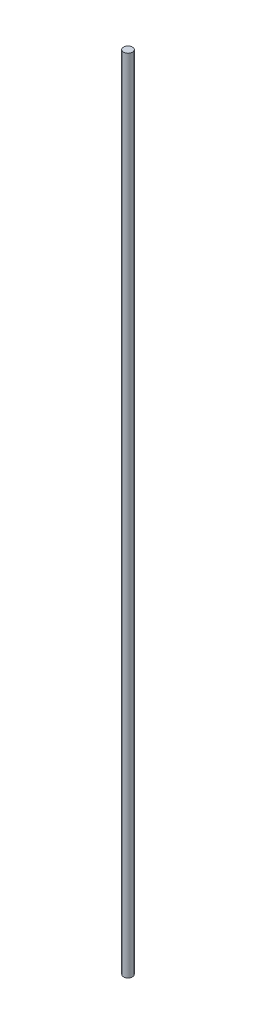
ISO-10303-21;
HEADER;
FILE_DESCRIPTION(('STEP AP214'),'2;1');
FILE_NAME('part.step','',(''),(''),'','','');
FILE_SCHEMA(('AUTOMOTIVE_DESIGN { 1 0 10303 214 1 1 1 1 }'));
ENDSEC;
DATA;
#1=APPLICATION_CONTEXT('core data for automotive mechanical design processes');
#2=APPLICATION_PROTOCOL_DEFINITION('international standard','automotive_design',2000,#1);
#3=PRODUCT_CONTEXT('',#1,'mechanical');
#4=PRODUCT('Part','Part','',(#3));
#5=PRODUCT_RELATED_PRODUCT_CATEGORY('part','',(#4));
#6=PRODUCT_DEFINITION_FORMATION('','',#4);
#7=PRODUCT_DEFINITION_CONTEXT('part definition',#1,'design');
#8=PRODUCT_DEFINITION('design','',#6,#7);
#9=PRODUCT_DEFINITION_SHAPE('','',#8);
#10=(LENGTH_UNIT() NAMED_UNIT(*) SI_UNIT(.MILLI.,.METRE.));
#11=(NAMED_UNIT(*) PLANE_ANGLE_UNIT() SI_UNIT($,.RADIAN.));
#12=(NAMED_UNIT(*) SI_UNIT($,.STERADIAN.) SOLID_ANGLE_UNIT());
#13=UNCERTAINTY_MEASURE_WITH_UNIT(LENGTH_MEASURE(1.E-05),#10,'distance_accuracy_value','');
#14=(GEOMETRIC_REPRESENTATION_CONTEXT(3) GLOBAL_UNCERTAINTY_ASSIGNED_CONTEXT((#13)) GLOBAL_UNIT_ASSIGNED_CONTEXT((#10,
#11,#12)) REPRESENTATION_CONTEXT('',''));
#15=CARTESIAN_POINT('',(0.,0.,0.));
#16=DIRECTION('',(0.,0.,1.));
#17=DIRECTION('',(1.,0.,0.));
#18=AXIS2_PLACEMENT_3D('',#15,#16,#17);
#19=CARTESIAN_POINT('',(0.,914.4,0.));
#20=DIRECTION('',(0.,-1.,0.));
#21=DIRECTION('',(0.,0.,-1.));
#22=AXIS2_PLACEMENT_3D('',#19,#20,#21);
#23=CYLINDRICAL_SURFACE('',#22,5.08);
#24=CARTESIAN_POINT('',(0.,914.4,0.));
#25=DIRECTION('',(0.,1.,0.));
#26=DIRECTION('',(0.,0.,1.));
#27=AXIS2_PLACEMENT_3D('',#24,#25,#26);
#28=CIRCLE('',#27,5.08);
#29=CARTESIAN_POINT('',(0.,914.4,5.08));
#30=VERTEX_POINT('',#29);
#31=EDGE_CURVE('E11',#30,#30,#28,.T.);
#32=ORIENTED_EDGE('',*,*,#31,.F.);
#33=EDGE_LOOP('',(#32));
#34=FACE_BOUND('',#33,.T.);
#35=CARTESIAN_POINT('',(0.,0.,0.));
#36=DIRECTION('',(0.,1.,0.));
#37=DIRECTION('',(0.,0.,1.));
#38=AXIS2_PLACEMENT_3D('',#35,#36,#37);
#39=CIRCLE('',#38,5.08);
#40=CARTESIAN_POINT('',(0.,0.,5.08));
#41=VERTEX_POINT('',#40);
#42=EDGE_CURVE('E47',#41,#41,#39,.T.);
#43=ORIENTED_EDGE('',*,*,#42,.T.);
#44=EDGE_LOOP('',(#43));
#45=FACE_BOUND('',#44,.T.);
#46=ADVANCED_FACE('F46',(#34,#45),#23,.T.);
#47=CARTESIAN_POINT('',(0.,914.4,0.));
#48=DIRECTION('',(0.,1.,0.));
#49=DIRECTION('',(0.,0.,1.));
#50=AXIS2_PLACEMENT_3D('',#47,#48,#49);
#51=PLANE('',#50);
#52=ORIENTED_EDGE('',*,*,#31,.T.);
#53=EDGE_LOOP('',(#52));
#54=FACE_BOUND('',#53,.T.);
#55=ADVANCED_FACE('F64',(#54),#51,.T.);
#56=CARTESIAN_POINT('',(0.,0.,0.));
#57=DIRECTION('',(0.,1.,0.));
#58=DIRECTION('',(0.,0.,1.));
#59=AXIS2_PLACEMENT_3D('',#56,#57,#58);
#60=PLANE('',#59);
#61=ORIENTED_EDGE('',*,*,#42,.F.);
#62=EDGE_LOOP('',(#61));
#63=FACE_BOUND('',#62,.T.);
#64=ADVANCED_FACE('F65',(#63),#60,.F.);
#65=CLOSED_SHELL('',(#46,#55,#64));
#66=MANIFOLD_SOLID_BREP('B2',#65);
#67=ADVANCED_BREP_SHAPE_REPRESENTATION('',(#18,#66),#14);
#68=SHAPE_DEFINITION_REPRESENTATION(#9,#67);
ENDSEC;
END-ISO-10303-21;
